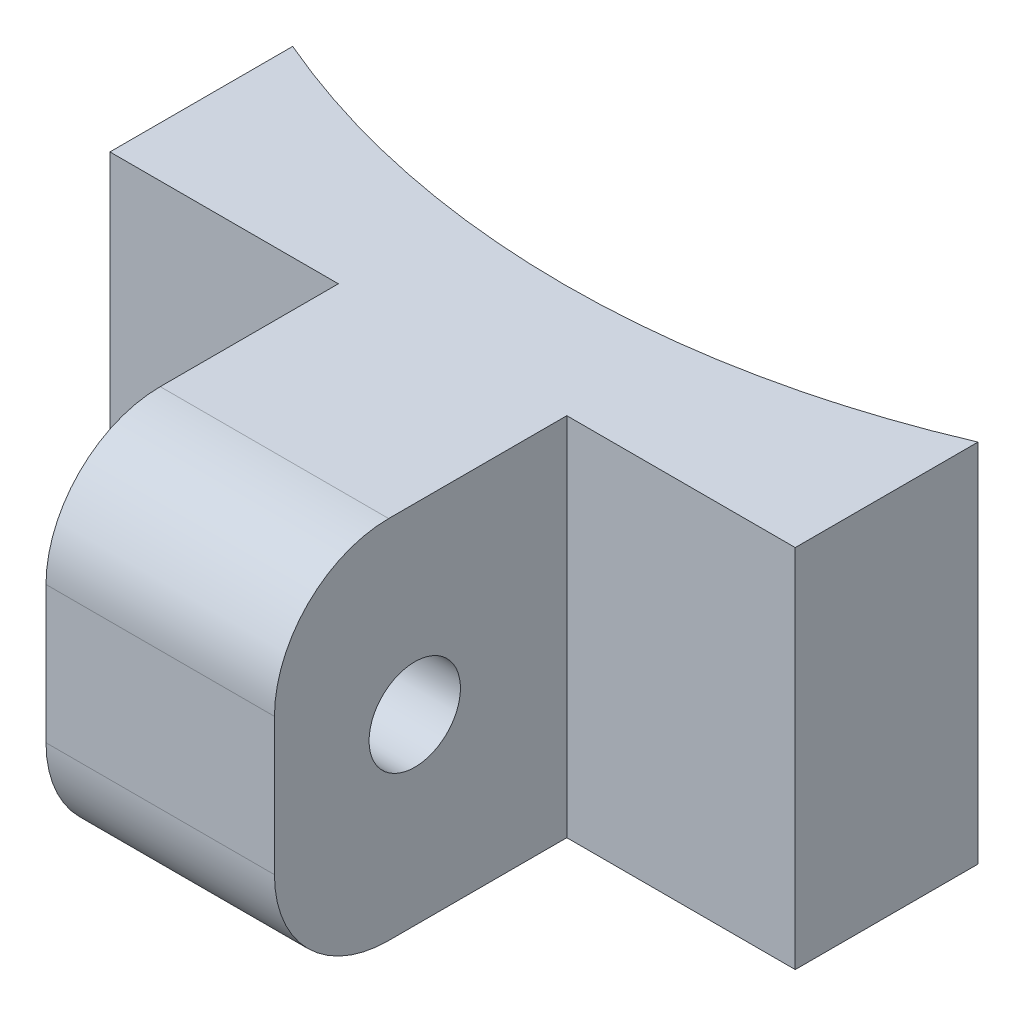
ISO-10303-21;
HEADER;
FILE_DESCRIPTION(('STEP AP214'),'2;1');
FILE_NAME('part.step','',(''),(''),'','','');
FILE_SCHEMA(('AUTOMOTIVE_DESIGN { 1 0 10303 214 1 1 1 1 }'));
ENDSEC;
DATA;
#1=APPLICATION_CONTEXT('core data for automotive mechanical design processes');
#2=APPLICATION_PROTOCOL_DEFINITION('international standard','automotive_design',2000,#1);
#3=PRODUCT_CONTEXT('',#1,'mechanical');
#4=PRODUCT('Part','Part','',(#3));
#5=PRODUCT_RELATED_PRODUCT_CATEGORY('part','',(#4));
#6=PRODUCT_DEFINITION_FORMATION('','',#4);
#7=PRODUCT_DEFINITION_CONTEXT('part definition',#1,'design');
#8=PRODUCT_DEFINITION('design','',#6,#7);
#9=PRODUCT_DEFINITION_SHAPE('','',#8);
#10=(LENGTH_UNIT() NAMED_UNIT(*) SI_UNIT(.MILLI.,.METRE.));
#11=(NAMED_UNIT(*) PLANE_ANGLE_UNIT() SI_UNIT($,.RADIAN.));
#12=(NAMED_UNIT(*) SI_UNIT($,.STERADIAN.) SOLID_ANGLE_UNIT());
#13=UNCERTAINTY_MEASURE_WITH_UNIT(LENGTH_MEASURE(1.E-05),#10,'distance_accuracy_value','');
#14=(GEOMETRIC_REPRESENTATION_CONTEXT(3) GLOBAL_UNCERTAINTY_ASSIGNED_CONTEXT((#13)) GLOBAL_UNIT_ASSIGNED_CONTEXT((#10,
#11,#12)) REPRESENTATION_CONTEXT('',''));
#15=CARTESIAN_POINT('',(0.,0.,0.));
#16=DIRECTION('',(0.,0.,1.));
#17=DIRECTION('',(1.,0.,0.));
#18=AXIS2_PLACEMENT_3D('',#15,#16,#17);
#19=CARTESIAN_POINT('',(-15.,22.,42.9141805001922));
#20=DIRECTION('',(0.,0.,-1.));
#21=DIRECTION('',(-1.,0.,0.));
#22=AXIS2_PLACEMENT_3D('',#19,#20,#21);
#23=PLANE('',#22);
#24=DIRECTION('',(0.,1.,0.));
#25=VECTOR('',#24,1.);
#26=CARTESIAN_POINT('',(5.,22.,42.9141805001922));
#27=LINE('',#26,#25);
#28=CARTESIAN_POINT('',(5.,6.,42.9141805001922));
#29=VERTEX_POINT('',#28);
#30=CARTESIAN_POINT('',(5.,22.,42.9141805001922));
#31=VERTEX_POINT('',#30);
#32=EDGE_CURVE('E57',#29,#31,#27,.T.);
#33=ORIENTED_EDGE('',*,*,#32,.F.);
#34=DIRECTION('',(1.,0.,0.));
#35=VECTOR('',#34,1.);
#36=CARTESIAN_POINT('',(-15.,6.,42.9141805001922));
#37=LINE('',#36,#35);
#38=CARTESIAN_POINT('',(15.,6.,42.9141805001922));
#39=VERTEX_POINT('',#38);
#40=EDGE_CURVE('E162',#29,#39,#37,.T.);
#41=ORIENTED_EDGE('',*,*,#40,.T.);
#42=DIRECTION('',(0.,-1.,0.));
#43=VECTOR('',#42,1.);
#44=CARTESIAN_POINT('',(15.,22.,42.9141805001922));
#45=LINE('',#44,#43);
#46=CARTESIAN_POINT('',(15.,22.,42.9141805001922));
#47=VERTEX_POINT('',#46);
#48=EDGE_CURVE('E174',#47,#39,#45,.T.);
#49=ORIENTED_EDGE('',*,*,#48,.F.);
#50=DIRECTION('',(1.,0.,0.));
#51=VECTOR('',#50,1.);
#52=CARTESIAN_POINT('',(-15.,22.,42.9141805001922));
#53=LINE('',#52,#51);
#54=EDGE_CURVE('E152',#31,#47,#53,.T.);
#55=ORIENTED_EDGE('',*,*,#54,.F.);
#56=EDGE_LOOP('',(#33,#41,#49,#55));
#57=FACE_BOUND('',#56,.T.);
#58=ADVANCED_FACE('F32',(#57),#23,.F.);
#59=CARTESIAN_POINT('',(0.,22.,0.));
#60=DIRECTION('',(0.,-1.,0.));
#61=DIRECTION('',(0.,0.,-1.));
#62=AXIS2_PLACEMENT_3D('',#59,#60,#61);
#63=CYLINDRICAL_SURFACE('',#62,38.);
#64=CARTESIAN_POINT('',(0.,6.,0.));
#65=DIRECTION('',(0.,-1.,0.));
#66=DIRECTION('',(0.,0.,1.));
#67=AXIS2_PLACEMENT_3D('',#64,#65,#66);
#68=CIRCLE('',#67,38.);
#69=CARTESIAN_POINT('',(15.,6.,34.9141805001922));
#70=VERTEX_POINT('',#69);
#71=CARTESIAN_POINT('',(-15.,6.,34.9141805001922));
#72=VERTEX_POINT('',#71);
#73=EDGE_CURVE('E137',#70,#72,#68,.T.);
#74=ORIENTED_EDGE('',*,*,#73,.T.);
#75=DIRECTION('',(0.,-1.,0.));
#76=VECTOR('',#75,1.);
#77=CARTESIAN_POINT('',(-15.,22.,34.9141805001922));
#78=LINE('',#77,#76);
#79=CARTESIAN_POINT('',(-15.,22.,34.9141805001922));
#80=VERTEX_POINT('',#79);
#81=EDGE_CURVE('E11',#80,#72,#78,.T.);
#82=ORIENTED_EDGE('',*,*,#81,.F.);
#83=CARTESIAN_POINT('',(0.,22.,0.));
#84=DIRECTION('',(0.,-1.,0.));
#85=DIRECTION('',(0.,0.,1.));
#86=AXIS2_PLACEMENT_3D('',#83,#84,#85);
#87=CIRCLE('',#86,38.);
#88=CARTESIAN_POINT('',(15.,22.,34.9141805001922));
#89=VERTEX_POINT('',#88);
#90=EDGE_CURVE('E146',#89,#80,#87,.T.);
#91=ORIENTED_EDGE('',*,*,#90,.F.);
#92=DIRECTION('',(0.,-1.,0.));
#93=VECTOR('',#92,1.);
#94=CARTESIAN_POINT('',(15.,22.,34.9141805001922));
#95=LINE('',#94,#93);
#96=EDGE_CURVE('E171',#89,#70,#95,.T.);
#97=ORIENTED_EDGE('',*,*,#96,.T.);
#98=EDGE_LOOP('',(#74,#82,#91,#97));
#99=FACE_BOUND('',#98,.T.);
#100=ADVANCED_FACE('F34',(#99),#63,.F.);
#101=CARTESIAN_POINT('',(-15.,22.,34.9141805001922));
#102=DIRECTION('',(1.,0.,0.));
#103=DIRECTION('',(0.,0.,-1.));
#104=AXIS2_PLACEMENT_3D('',#101,#102,#103);
#105=PLANE('',#104);
#106=DIRECTION('',(0.,0.,1.));
#107=VECTOR('',#106,1.);
#108=CARTESIAN_POINT('',(-15.,6.,34.9141805001922));
#109=LINE('',#108,#107);
#110=CARTESIAN_POINT('',(-15.,6.,42.9141805001922));
#111=VERTEX_POINT('',#110);
#112=EDGE_CURVE('E140',#72,#111,#109,.T.);
#113=ORIENTED_EDGE('',*,*,#112,.T.);
#114=DIRECTION('',(0.,-1.,0.));
#115=VECTOR('',#114,1.);
#116=CARTESIAN_POINT('',(-15.,22.,42.9141805001922));
#117=LINE('',#116,#115);
#118=CARTESIAN_POINT('',(-15.,22.,42.9141805001922));
#119=VERTEX_POINT('',#118);
#120=EDGE_CURVE('E41',#119,#111,#117,.T.);
#121=ORIENTED_EDGE('',*,*,#120,.F.);
#122=DIRECTION('',(0.,0.,1.));
#123=VECTOR('',#122,1.);
#124=CARTESIAN_POINT('',(-15.,22.,34.9141805001922));
#125=LINE('',#124,#123);
#126=EDGE_CURVE('E149',#80,#119,#125,.T.);
#127=ORIENTED_EDGE('',*,*,#126,.F.);
#128=ORIENTED_EDGE('',*,*,#81,.T.);
#129=EDGE_LOOP('',(#113,#121,#127,#128));
#130=FACE_BOUND('',#129,.T.);
#131=ADVANCED_FACE('F233',(#130),#105,.F.);
#132=CARTESIAN_POINT('',(-5.,6.,42.9141805001922));
#133=VERTEX_POINT('',#132);
#134=EDGE_CURVE('E165',#111,#133,#37,.T.);
#135=ORIENTED_EDGE('',*,*,#134,.T.);
#136=DIRECTION('',(0.,1.,0.));
#137=VECTOR('',#136,1.);
#138=CARTESIAN_POINT('',(-5.,22.,42.9141805001922));
#139=LINE('',#138,#137);
#140=CARTESIAN_POINT('',(-5.,22.,42.9141805001922));
#141=VERTEX_POINT('',#140);
#142=EDGE_CURVE('E49',#133,#141,#139,.T.);
#143=ORIENTED_EDGE('',*,*,#142,.T.);
#144=EDGE_CURVE('E160',#119,#141,#53,.T.);
#145=ORIENTED_EDGE('',*,*,#144,.F.);
#146=ORIENTED_EDGE('',*,*,#120,.T.);
#147=EDGE_LOOP('',(#135,#143,#145,#146));
#148=FACE_BOUND('',#147,.T.);
#149=ADVANCED_FACE('F180',(#148),#23,.F.);
#150=CARTESIAN_POINT('',(15.,22.,34.9141805001922));
#151=DIRECTION('',(-1.,0.,0.));
#152=DIRECTION('',(0.,0.,1.));
#153=AXIS2_PLACEMENT_3D('',#150,#151,#152);
#154=PLANE('',#153);
#155=DIRECTION('',(0.,0.,-1.));
#156=VECTOR('',#155,1.);
#157=CARTESIAN_POINT('',(15.,6.,34.9141805001922));
#158=LINE('',#157,#156);
#159=EDGE_CURVE('E150',#39,#70,#158,.T.);
#160=ORIENTED_EDGE('',*,*,#159,.T.);
#161=ORIENTED_EDGE('',*,*,#96,.F.);
#162=DIRECTION('',(0.,0.,-1.));
#163=VECTOR('',#162,1.);
#164=CARTESIAN_POINT('',(15.,22.,34.9141805001922));
#165=LINE('',#164,#163);
#166=EDGE_CURVE('E155',#47,#89,#165,.T.);
#167=ORIENTED_EDGE('',*,*,#166,.F.);
#168=ORIENTED_EDGE('',*,*,#48,.T.);
#169=EDGE_LOOP('',(#160,#161,#167,#168));
#170=FACE_BOUND('',#169,.T.);
#171=ADVANCED_FACE('F227',(#170),#154,.F.);
#172=CARTESIAN_POINT('',(0.,22.,0.));
#173=DIRECTION('',(0.,1.,0.));
#174=DIRECTION('',(0.,0.,1.));
#175=AXIS2_PLACEMENT_3D('',#172,#173,#174);
#176=PLANE('',#175);
#177=ORIENTED_EDGE('',*,*,#90,.T.);
#178=ORIENTED_EDGE('',*,*,#126,.T.);
#179=ORIENTED_EDGE('',*,*,#144,.T.);
#180=DIRECTION('',(0.,0.,1.));
#181=VECTOR('',#180,1.);
#182=CARTESIAN_POINT('',(-5.,22.,42.9141805001922));
#183=LINE('',#182,#181);
#184=CARTESIAN_POINT('',(-5.,22.,50.7128586652416));
#185=VERTEX_POINT('',#184);
#186=EDGE_CURVE('E132',#141,#185,#183,.T.);
#187=ORIENTED_EDGE('',*,*,#186,.T.);
#188=DIRECTION('',(-1.,0.,0.));
#189=VECTOR('',#188,1.);
#190=CARTESIAN_POINT('',(5.,22.,50.7128586652416));
#191=LINE('',#190,#189);
#192=CARTESIAN_POINT('',(5.,22.,50.7128586652416));
#193=VERTEX_POINT('',#192);
#194=EDGE_CURVE('E206',#193,#185,#191,.T.);
#195=ORIENTED_EDGE('',*,*,#194,.F.);
#196=DIRECTION('',(0.,0.,1.));
#197=VECTOR('',#196,1.);
#198=CARTESIAN_POINT('',(5.,22.,42.9141805001922));
#199=LINE('',#198,#197);
#200=EDGE_CURVE('E128',#31,#193,#199,.T.);
#201=ORIENTED_EDGE('',*,*,#200,.F.);
#202=ORIENTED_EDGE('',*,*,#54,.T.);
#203=ORIENTED_EDGE('',*,*,#166,.T.);
#204=EDGE_LOOP('',(#177,#178,#179,#187,#195,#201,#202,#203));
#205=FACE_BOUND('',#204,.T.);
#206=ADVANCED_FACE('F231',(#205),#176,.T.);
#207=CARTESIAN_POINT('',(0.,6.,0.));
#208=DIRECTION('',(0.,1.,0.));
#209=DIRECTION('',(0.,0.,1.));
#210=AXIS2_PLACEMENT_3D('',#207,#208,#209);
#211=PLANE('',#210);
#212=ORIENTED_EDGE('',*,*,#73,.F.);
#213=ORIENTED_EDGE('',*,*,#159,.F.);
#214=ORIENTED_EDGE('',*,*,#40,.F.);
#215=DIRECTION('',(0.,0.,-1.));
#216=VECTOR('',#215,1.);
#217=CARTESIAN_POINT('',(5.,6.,42.9141805001922));
#218=LINE('',#217,#216);
#219=CARTESIAN_POINT('',(5.,6.,50.7128586652416));
#220=VERTEX_POINT('',#219);
#221=EDGE_CURVE('E208',#220,#29,#218,.T.);
#222=ORIENTED_EDGE('',*,*,#221,.F.);
#223=DIRECTION('',(-1.,0.,0.));
#224=VECTOR('',#223,1.);
#225=CARTESIAN_POINT('',(5.,6.,50.7128586652416));
#226=LINE('',#225,#224);
#227=CARTESIAN_POINT('',(-5.,6.,50.7128586652416));
#228=VERTEX_POINT('',#227);
#229=EDGE_CURVE('E142',#220,#228,#226,.T.);
#230=ORIENTED_EDGE('',*,*,#229,.T.);
#231=DIRECTION('',(0.,0.,-1.));
#232=VECTOR('',#231,1.);
#233=CARTESIAN_POINT('',(-5.,6.,42.9141805001922));
#234=LINE('',#233,#232);
#235=EDGE_CURVE('E188',#228,#133,#234,.T.);
#236=ORIENTED_EDGE('',*,*,#235,.T.);
#237=ORIENTED_EDGE('',*,*,#134,.F.);
#238=ORIENTED_EDGE('',*,*,#112,.F.);
#239=EDGE_LOOP('',(#212,#213,#214,#222,#230,#236,#237,#238));
#240=FACE_BOUND('',#239,.T.);
#241=ADVANCED_FACE('F185',(#240),#211,.F.);
#242=CARTESIAN_POINT('',(5.,17.,50.7128586652416));
#243=DIRECTION('',(-1.,0.,0.));
#244=DIRECTION('',(0.,0.,1.));
#245=AXIS2_PLACEMENT_3D('',#242,#243,#244);
#246=CYLINDRICAL_SURFACE('',#245,5.);
#247=CARTESIAN_POINT('',(-5.,17.,50.7128586652416));
#248=DIRECTION('',(1.,0.,0.));
#249=DIRECTION('',(0.,0.,1.));
#250=AXIS2_PLACEMENT_3D('',#247,#248,#249);
#251=CIRCLE('',#250,5.);
#252=CARTESIAN_POINT('',(-5.,17.,55.7128586652416));
#253=VERTEX_POINT('',#252);
#254=EDGE_CURVE('E136',#185,#253,#251,.T.);
#255=ORIENTED_EDGE('',*,*,#254,.T.);
#256=DIRECTION('',(-1.,0.,0.));
#257=VECTOR('',#256,1.);
#258=CARTESIAN_POINT('',(5.,17.,55.7128586652416));
#259=LINE('',#258,#257);
#260=CARTESIAN_POINT('',(5.,17.,55.7128586652416));
#261=VERTEX_POINT('',#260);
#262=EDGE_CURVE('E116',#261,#253,#259,.T.);
#263=ORIENTED_EDGE('',*,*,#262,.F.);
#264=CARTESIAN_POINT('',(5.,17.,50.7128586652416));
#265=DIRECTION('',(1.,0.,0.));
#266=DIRECTION('',(0.,0.,1.));
#267=AXIS2_PLACEMENT_3D('',#264,#265,#266);
#268=CIRCLE('',#267,5.);
#269=EDGE_CURVE('E123',#193,#261,#268,.T.);
#270=ORIENTED_EDGE('',*,*,#269,.F.);
#271=ORIENTED_EDGE('',*,*,#194,.T.);
#272=EDGE_LOOP('',(#255,#263,#270,#271));
#273=FACE_BOUND('',#272,.T.);
#274=ADVANCED_FACE('F134',(#273),#246,.T.);
#275=CARTESIAN_POINT('',(5.,17.,55.7128586652416));
#276=DIRECTION('',(0.,0.,-1.));
#277=DIRECTION('',(-1.,0.,0.));
#278=AXIS2_PLACEMENT_3D('',#275,#276,#277);
#279=PLANE('',#278);
#280=DIRECTION('',(0.,-1.,0.));
#281=VECTOR('',#280,1.);
#282=CARTESIAN_POINT('',(-5.,17.,55.7128586652416));
#283=LINE('',#282,#281);
#284=CARTESIAN_POINT('',(-5.,11.,55.7128586652416));
#285=VERTEX_POINT('',#284);
#286=EDGE_CURVE('E219',#253,#285,#283,.T.);
#287=ORIENTED_EDGE('',*,*,#286,.T.);
#288=DIRECTION('',(-1.,0.,0.));
#289=VECTOR('',#288,1.);
#290=CARTESIAN_POINT('',(5.,11.,55.7128586652416));
#291=LINE('',#290,#289);
#292=CARTESIAN_POINT('',(5.,11.,55.7128586652416));
#293=VERTEX_POINT('',#292);
#294=EDGE_CURVE('E119',#293,#285,#291,.T.);
#295=ORIENTED_EDGE('',*,*,#294,.F.);
#296=DIRECTION('',(0.,-1.,0.));
#297=VECTOR('',#296,1.);
#298=CARTESIAN_POINT('',(5.,17.,55.7128586652416));
#299=LINE('',#298,#297);
#300=EDGE_CURVE('E112',#261,#293,#299,.T.);
#301=ORIENTED_EDGE('',*,*,#300,.F.);
#302=ORIENTED_EDGE('',*,*,#262,.T.);
#303=EDGE_LOOP('',(#287,#295,#301,#302));
#304=FACE_BOUND('',#303,.T.);
#305=ADVANCED_FACE('F114',(#304),#279,.F.);
#306=CARTESIAN_POINT('',(5.,11.,50.7128586652416));
#307=DIRECTION('',(-1.,0.,0.));
#308=DIRECTION('',(0.,0.,1.));
#309=AXIS2_PLACEMENT_3D('',#306,#307,#308);
#310=CYLINDRICAL_SURFACE('',#309,4.99999999999999);
#311=CARTESIAN_POINT('',(-5.,11.,50.7128586652416));
#312=DIRECTION('',(1.,0.,0.));
#313=DIRECTION('',(0.,0.,1.));
#314=AXIS2_PLACEMENT_3D('',#311,#312,#313);
#315=CIRCLE('',#314,4.99999999999999);
#316=EDGE_CURVE('E193',#285,#228,#315,.T.);
#317=ORIENTED_EDGE('',*,*,#316,.T.);
#318=ORIENTED_EDGE('',*,*,#229,.F.);
#319=CARTESIAN_POINT('',(5.,11.,50.7128586652416));
#320=DIRECTION('',(1.,0.,0.));
#321=DIRECTION('',(0.,0.,1.));
#322=AXIS2_PLACEMENT_3D('',#319,#320,#321);
#323=CIRCLE('',#322,4.99999999999999);
#324=EDGE_CURVE('E122',#293,#220,#323,.T.);
#325=ORIENTED_EDGE('',*,*,#324,.F.);
#326=ORIENTED_EDGE('',*,*,#294,.T.);
#327=EDGE_LOOP('',(#317,#318,#325,#326));
#328=FACE_BOUND('',#327,.T.);
#329=ADVANCED_FACE('F222',(#328),#310,.T.);
#330=CARTESIAN_POINT('',(5.,17.,50.7128586652416));
#331=DIRECTION('',(-1.,0.,0.));
#332=DIRECTION('',(0.,0.,1.));
#333=AXIS2_PLACEMENT_3D('',#330,#331,#332);
#334=PLANE('',#333);
#335=CARTESIAN_POINT('',(5.,14.,49.5713066519146));
#336=DIRECTION('',(-1.,0.,0.));
#337=DIRECTION('',(0.,0.,1.));
#338=AXIS2_PLACEMENT_3D('',#335,#336,#337);
#339=CIRCLE('',#338,2.);
#340=CARTESIAN_POINT('',(5.,14.,51.5713066519146));
#341=VERTEX_POINT('',#340);
#342=EDGE_CURVE('E220',#341,#341,#339,.T.);
#343=ORIENTED_EDGE('',*,*,#342,.T.);
#344=EDGE_LOOP('',(#343));
#345=FACE_BOUND('',#344,.T.);
#346=ORIENTED_EDGE('',*,*,#269,.T.);
#347=ORIENTED_EDGE('',*,*,#300,.T.);
#348=ORIENTED_EDGE('',*,*,#324,.T.);
#349=ORIENTED_EDGE('',*,*,#221,.T.);
#350=ORIENTED_EDGE('',*,*,#32,.T.);
#351=ORIENTED_EDGE('',*,*,#200,.T.);
#352=EDGE_LOOP('',(#346,#347,#348,#349,#350,#351));
#353=FACE_BOUND('',#352,.T.);
#354=ADVANCED_FACE('F126',(#345,#353),#334,.F.);
#355=CARTESIAN_POINT('',(-5.,17.,50.7128586652416));
#356=DIRECTION('',(-1.,0.,0.));
#357=DIRECTION('',(0.,0.,1.));
#358=AXIS2_PLACEMENT_3D('',#355,#356,#357);
#359=PLANE('',#358);
#360=CARTESIAN_POINT('',(-5.,14.,49.5713066519146));
#361=DIRECTION('',(-1.,0.,0.));
#362=DIRECTION('',(0.,0.,1.));
#363=AXIS2_PLACEMENT_3D('',#360,#361,#362);
#364=CIRCLE('',#363,2.);
#365=CARTESIAN_POINT('',(-5.,14.,51.5713066519146));
#366=VERTEX_POINT('',#365);
#367=EDGE_CURVE('E36',#366,#366,#364,.T.);
#368=ORIENTED_EDGE('',*,*,#367,.F.);
#369=EDGE_LOOP('',(#368));
#370=FACE_BOUND('',#369,.T.);
#371=ORIENTED_EDGE('',*,*,#254,.F.);
#372=ORIENTED_EDGE('',*,*,#186,.F.);
#373=ORIENTED_EDGE('',*,*,#142,.F.);
#374=ORIENTED_EDGE('',*,*,#235,.F.);
#375=ORIENTED_EDGE('',*,*,#316,.F.);
#376=ORIENTED_EDGE('',*,*,#286,.F.);
#377=EDGE_LOOP('',(#371,#372,#373,#374,#375,#376));
#378=FACE_BOUND('',#377,.T.);
#379=ADVANCED_FACE('F196',(#370,#378),#359,.T.);
#380=CARTESIAN_POINT('',(10.,14.,49.5713066519146));
#381=DIRECTION('',(-1.,0.,0.));
#382=DIRECTION('',(0.,0.,1.));
#383=AXIS2_PLACEMENT_3D('',#380,#381,#382);
#384=CYLINDRICAL_SURFACE('',#383,2.);
#385=ORIENTED_EDGE('',*,*,#367,.T.);
#386=EDGE_LOOP('',(#385));
#387=FACE_BOUND('',#386,.T.);
#388=ORIENTED_EDGE('',*,*,#342,.F.);
#389=EDGE_LOOP('',(#388));
#390=FACE_BOUND('',#389,.T.);
#391=ADVANCED_FACE('F263',(#387,#390),#384,.F.);
#392=CLOSED_SHELL('',(#58,#100,#131,#149,#171,#206,#241,#274,#305,#329,#354,#379,#391));
#393=MANIFOLD_SOLID_BREP('B2',#392);
#394=ADVANCED_BREP_SHAPE_REPRESENTATION('',(#18,#393),#14);
#395=SHAPE_DEFINITION_REPRESENTATION(#9,#394);
ENDSEC;
END-ISO-10303-21;
